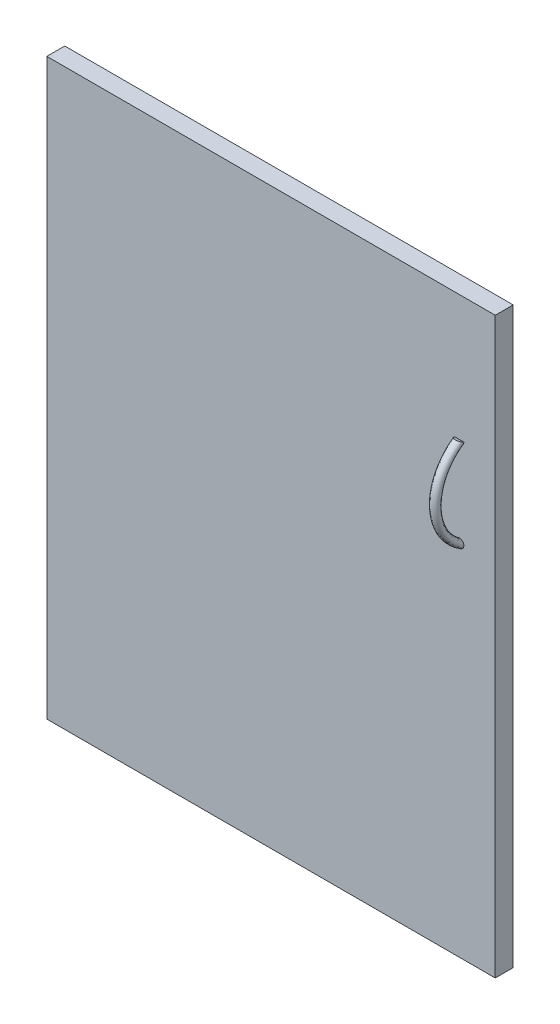
ISO-10303-21;
HEADER;
FILE_DESCRIPTION(('STEP AP214'),'2;1');
FILE_NAME('part.step','',(''),(''),'','','');
FILE_SCHEMA(('AUTOMOTIVE_DESIGN { 1 0 10303 214 1 1 1 1 }'));
ENDSEC;
DATA;
#1=APPLICATION_CONTEXT('core data for automotive mechanical design processes');
#2=APPLICATION_PROTOCOL_DEFINITION('international standard','automotive_design',2000,#1);
#3=PRODUCT_CONTEXT('',#1,'mechanical');
#4=PRODUCT('Part','Part','',(#3));
#5=PRODUCT_RELATED_PRODUCT_CATEGORY('part','',(#4));
#6=PRODUCT_DEFINITION_FORMATION('','',#4);
#7=PRODUCT_DEFINITION_CONTEXT('part definition',#1,'design');
#8=PRODUCT_DEFINITION('design','',#6,#7);
#9=PRODUCT_DEFINITION_SHAPE('','',#8);
#10=(LENGTH_UNIT() NAMED_UNIT(*) SI_UNIT(.MILLI.,.METRE.));
#11=(NAMED_UNIT(*) PLANE_ANGLE_UNIT() SI_UNIT($,.RADIAN.));
#12=(NAMED_UNIT(*) SI_UNIT($,.STERADIAN.) SOLID_ANGLE_UNIT());
#13=UNCERTAINTY_MEASURE_WITH_UNIT(LENGTH_MEASURE(1.E-05),#10,'distance_accuracy_value','');
#14=(GEOMETRIC_REPRESENTATION_CONTEXT(3) GLOBAL_UNCERTAINTY_ASSIGNED_CONTEXT((#13)) GLOBAL_UNIT_ASSIGNED_CONTEXT((#10,
#11,#12)) REPRESENTATION_CONTEXT('',''));
#15=CARTESIAN_POINT('',(0.,0.,0.));
#16=DIRECTION('',(0.,0.,1.));
#17=DIRECTION('',(1.,0.,0.));
#18=AXIS2_PLACEMENT_3D('',#15,#16,#17);
#19=CARTESIAN_POINT('',(12.5,16.,1.));
#20=DIRECTION('',(-1.,0.,0.));
#21=DIRECTION('',(0.,-1.,0.));
#22=AXIS2_PLACEMENT_3D('',#19,#20,#21);
#23=PLANE('',#22);
#24=DIRECTION('',(0.,1.,0.));
#25=VECTOR('',#24,1.);
#26=CARTESIAN_POINT('',(12.5,16.,0.));
#27=LINE('',#26,#25);
#28=CARTESIAN_POINT('',(12.5,-16.,0.));
#29=VERTEX_POINT('',#28);
#30=CARTESIAN_POINT('',(12.5,16.,0.));
#31=VERTEX_POINT('',#30);
#32=EDGE_CURVE('E99',#29,#31,#27,.T.);
#33=ORIENTED_EDGE('',*,*,#32,.T.);
#34=DIRECTION('',(0.,0.,-1.));
#35=VECTOR('',#34,1.);
#36=CARTESIAN_POINT('',(12.5,16.,1.));
#37=LINE('',#36,#35);
#38=CARTESIAN_POINT('',(12.5,16.,1.));
#39=VERTEX_POINT('',#38);
#40=EDGE_CURVE('E96',#39,#31,#37,.T.);
#41=ORIENTED_EDGE('',*,*,#40,.F.);
#42=DIRECTION('',(0.,1.,0.));
#43=VECTOR('',#42,1.);
#44=CARTESIAN_POINT('',(12.5,16.,1.));
#45=LINE('',#44,#43);
#46=CARTESIAN_POINT('',(12.5,-16.,1.));
#47=VERTEX_POINT('',#46);
#48=EDGE_CURVE('E105',#47,#39,#45,.T.);
#49=ORIENTED_EDGE('',*,*,#48,.F.);
#50=DIRECTION('',(0.,0.,-1.));
#51=VECTOR('',#50,1.);
#52=CARTESIAN_POINT('',(12.5,-16.,1.));
#53=LINE('',#52,#51);
#54=EDGE_CURVE('E110',#47,#29,#53,.T.);
#55=ORIENTED_EDGE('',*,*,#54,.T.);
#56=EDGE_LOOP('',(#33,#41,#49,#55));
#57=FACE_BOUND('',#56,.T.);
#58=ADVANCED_FACE('F35',(#57),#23,.F.);
#59=CARTESIAN_POINT('',(-12.5,16.,1.));
#60=DIRECTION('',(0.,-1.,0.));
#61=DIRECTION('',(0.,0.,-1.));
#62=AXIS2_PLACEMENT_3D('',#59,#60,#61);
#63=PLANE('',#62);
#64=DIRECTION('',(-1.,0.,0.));
#65=VECTOR('',#64,1.);
#66=CARTESIAN_POINT('',(-12.5,16.,0.));
#67=LINE('',#66,#65);
#68=CARTESIAN_POINT('',(-12.5,16.,0.));
#69=VERTEX_POINT('',#68);
#70=EDGE_CURVE('E102',#31,#69,#67,.T.);
#71=ORIENTED_EDGE('',*,*,#70,.T.);
#72=DIRECTION('',(0.,0.,-1.));
#73=VECTOR('',#72,1.);
#74=CARTESIAN_POINT('',(-12.5,16.,1.));
#75=LINE('',#74,#73);
#76=CARTESIAN_POINT('',(-12.5,16.,1.));
#77=VERTEX_POINT('',#76);
#78=EDGE_CURVE('E119',#77,#69,#75,.T.);
#79=ORIENTED_EDGE('',*,*,#78,.F.);
#80=DIRECTION('',(-1.,0.,0.));
#81=VECTOR('',#80,1.);
#82=CARTESIAN_POINT('',(-12.5,16.,1.));
#83=LINE('',#82,#81);
#84=EDGE_CURVE('E86',#39,#77,#83,.T.);
#85=ORIENTED_EDGE('',*,*,#84,.F.);
#86=ORIENTED_EDGE('',*,*,#40,.T.);
#87=EDGE_LOOP('',(#71,#79,#85,#86));
#88=FACE_BOUND('',#87,.T.);
#89=ADVANCED_FACE('F147',(#88),#63,.F.);
#90=CARTESIAN_POINT('',(-12.5,16.,1.));
#91=DIRECTION('',(1.,0.,0.));
#92=DIRECTION('',(0.,1.,0.));
#93=AXIS2_PLACEMENT_3D('',#90,#91,#92);
#94=PLANE('',#93);
#95=DIRECTION('',(0.,-1.,0.));
#96=VECTOR('',#95,1.);
#97=CARTESIAN_POINT('',(-12.5,16.,0.));
#98=LINE('',#97,#96);
#99=CARTESIAN_POINT('',(-12.5,-16.,0.));
#100=VERTEX_POINT('',#99);
#101=EDGE_CURVE('E113',#69,#100,#98,.T.);
#102=ORIENTED_EDGE('',*,*,#101,.T.);
#103=DIRECTION('',(0.,0.,-1.));
#104=VECTOR('',#103,1.);
#105=CARTESIAN_POINT('',(-12.5,-16.,1.));
#106=LINE('',#105,#104);
#107=CARTESIAN_POINT('',(-12.5,-16.,1.));
#108=VERTEX_POINT('',#107);
#109=EDGE_CURVE('E117',#108,#100,#106,.T.);
#110=ORIENTED_EDGE('',*,*,#109,.F.);
#111=DIRECTION('',(0.,-1.,0.));
#112=VECTOR('',#111,1.);
#113=CARTESIAN_POINT('',(-12.5,16.,1.));
#114=LINE('',#113,#112);
#115=EDGE_CURVE('E108',#77,#108,#114,.T.);
#116=ORIENTED_EDGE('',*,*,#115,.F.);
#117=ORIENTED_EDGE('',*,*,#78,.T.);
#118=EDGE_LOOP('',(#102,#110,#116,#117));
#119=FACE_BOUND('',#118,.T.);
#120=ADVANCED_FACE('F152',(#119),#94,.F.);
#121=CARTESIAN_POINT('',(-12.5,-16.,1.));
#122=DIRECTION('',(0.,1.,0.));
#123=DIRECTION('',(0.,0.,1.));
#124=AXIS2_PLACEMENT_3D('',#121,#122,#123);
#125=PLANE('',#124);
#126=DIRECTION('',(1.,0.,0.));
#127=VECTOR('',#126,1.);
#128=CARTESIAN_POINT('',(-12.5,-16.,0.));
#129=LINE('',#128,#127);
#130=EDGE_CURVE('E78',#100,#29,#129,.T.);
#131=ORIENTED_EDGE('',*,*,#130,.T.);
#132=ORIENTED_EDGE('',*,*,#54,.F.);
#133=DIRECTION('',(1.,0.,0.));
#134=VECTOR('',#133,1.);
#135=CARTESIAN_POINT('',(-12.5,-16.,1.));
#136=LINE('',#135,#134);
#137=EDGE_CURVE('E57',#108,#47,#136,.T.);
#138=ORIENTED_EDGE('',*,*,#137,.F.);
#139=ORIENTED_EDGE('',*,*,#109,.T.);
#140=EDGE_LOOP('',(#131,#132,#138,#139));
#141=FACE_BOUND('',#140,.T.);
#142=ADVANCED_FACE('F161',(#141),#125,.F.);
#143=CARTESIAN_POINT('',(0.,0.,1.));
#144=DIRECTION('',(0.,0.,1.));
#145=DIRECTION('',(1.,0.,0.));
#146=AXIS2_PLACEMENT_3D('',#143,#144,#145);
#147=PLANE('',#146);
#148=CARTESIAN_POINT('',(10.5,4.,1.));
#149=DIRECTION('',(0.,0.,1.));
#150=DIRECTION('',(1.,0.,0.));
#151=AXIS2_PLACEMENT_3D('',#148,#149,#150);
#152=CIRCLE('',#151,0.25);
#153=CARTESIAN_POINT('',(10.75,4.,1.));
#154=VERTEX_POINT('',#153);
#155=EDGE_CURVE('E11',#154,#154,#152,.T.);
#156=ORIENTED_EDGE('',*,*,#155,.F.);
#157=EDGE_LOOP('',(#156));
#158=FACE_BOUND('',#157,.T.);
#159=DIRECTION('',(-1.,0.,0.));
#160=VECTOR('',#159,1.);
#161=CARTESIAN_POINT('',(0.,9.,1.));
#162=LINE('',#161,#160);
#163=CARTESIAN_POINT('',(10.75,9.,1.));
#164=VERTEX_POINT('',#163);
#165=CARTESIAN_POINT('',(10.25,8.99999999999961,1.));
#166=VERTEX_POINT('',#165);
#167=EDGE_CURVE('E42',#164,#166,#162,.T.);
#168=ORIENTED_EDGE('',*,*,#167,.F.);
#169=CARTESIAN_POINT('',(10.25,8.99999999999961,1.));
#170=CARTESIAN_POINT('',(10.2499849383462,8.98521380831302,1.));
#171=CARTESIAN_POINT('',(10.2513107879814,8.97043090602274,1.));
#172=CARTESIAN_POINT('',(10.2565342684534,8.94134485033556,1.));
#173=CARTESIAN_POINT('',(10.2604287156994,8.92704112606339,1.));
#174=CARTESIAN_POINT('',(10.2704349955121,8.90000922152134,1.));
#175=CARTESIAN_POINT('',(10.2764320160511,8.88723841818464,1.));
#176=CARTESIAN_POINT('',(10.2904825810203,8.86288754550716,1.));
#177=CARTESIAN_POINT('',(10.2985355428519,8.85130714014125,1.));
#178=CARTESIAN_POINT('',(10.3164662379724,8.82966876791737,1.));
#179=CARTESIAN_POINT('',(10.3263429504422,8.81960995507085,1.));
#180=CARTESIAN_POINT('',(10.3476589094819,8.80127896220533,1.));
#181=CARTESIAN_POINT('',(10.3591003242637,8.79300930321421,1.));
#182=CARTESIAN_POINT('',(10.3831932114465,8.77851971922293,1.));
#183=CARTESIAN_POINT('',(10.3958430021192,8.7722969975675,1.));
#184=CARTESIAN_POINT('',(10.4220250251267,8.7620551260108,1.));
#185=CARTESIAN_POINT('',(10.4355584238193,8.75803895734081,1.));
#186=CARTESIAN_POINT('',(10.4630982543969,8.75233921796589,1.));
#187=CARTESIAN_POINT('',(10.4771043618048,8.75065407926,1.));
#188=CARTESIAN_POINT('',(10.5052006918618,8.74965913010081,1.));
#189=CARTESIAN_POINT('',(10.5192909145128,8.7503493197005,1.));
#190=CARTESIAN_POINT('',(10.5471649338561,8.75408673860879,1.));
#191=CARTESIAN_POINT('',(10.5609485178429,8.75713555460837,1.));
#192=CARTESIAN_POINT('',(10.5877894183578,8.76549977698985,1.));
#193=CARTESIAN_POINT('',(10.6008476872816,8.77081212763868,1.));
#194=CARTESIAN_POINT('',(10.6259051598728,8.78356118255448,1.));
#195=CARTESIAN_POINT('',(10.6379028843724,8.79100079442047,1.));
#196=CARTESIAN_POINT('',(10.6604620598936,8.80777811884476,1.));
#197=CARTESIAN_POINT('',(10.6710254944948,8.81711316452532,1.));
#198=CARTESIAN_POINT('',(10.6904502594716,8.8374374474221,0.999999999999999));
#199=CARTESIAN_POINT('',(10.6993091763776,8.84842899144101,0.999999999999997));
#200=CARTESIAN_POINT('',(10.7150431990228,8.87172799978713,1.));
#201=CARTESIAN_POINT('',(10.7219210843864,8.8840335867711,1.00000000000001));
#202=CARTESIAN_POINT('',(10.7335244640276,8.90964299397018,0.999999999999988));
#203=CARTESIAN_POINT('',(10.7382465667954,8.92294834900592,0.999999999999958));
#204=CARTESIAN_POINT('',(10.7453800964998,8.95014517930888,1.00000000000004));
#205=CARTESIAN_POINT('',(10.7477954860292,8.96403560648079,1.00000000000016));
#206=CARTESIAN_POINT('',(10.7496782736988,8.98533103875346,0.999999999999827));
#207=CARTESIAN_POINT('',(10.7500024341253,8.99266762535788,0.999999999999624));
#208=CARTESIAN_POINT('',(10.75,8.99999999999985,0.999999999999273));
#209=B_SPLINE_CURVE_WITH_KNOTS('',3,(#169,#170,#171,#172,#173,#174,#175,#176,#177,#178,#179,
#180,#181,#182,#183,#184,#185,#186,#187,#188,#189,#190,#191,#192,#193,#194,#195,#196,#197,#198,
#199,#200,#201,#202,#203,#204,#205,#206,#207,#208),.UNSPECIFIED.,.F.,.F.,(4,2,2,2,2,2,2,2,2,2,2,
2,2,2,2,2,2,2,2,4),(0.,0.0442952865142476,0.0885357751367148,0.130662886941268,
0.172778074274131,0.214869759279339,0.257020373261495,0.299113156873605,0.341262672254039,
0.38338382134441,0.425504971374234,0.467654481735632,0.509747270365631,0.551897869871189,
0.593989569352206,0.636140435884225,0.678231868338639,0.720389293392306,0.762474167249236,
0.784475293763798),.UNSPECIFIED.);
#210=EDGE_CURVE('E48',#166,#164,#209,.T.);
#211=ORIENTED_EDGE('',*,*,#210,.F.);
#212=EDGE_LOOP('',(#168,#211));
#213=FACE_BOUND('',#212,.T.);
#214=ORIENTED_EDGE('',*,*,#48,.T.);
#215=ORIENTED_EDGE('',*,*,#84,.T.);
#216=ORIENTED_EDGE('',*,*,#115,.T.);
#217=ORIENTED_EDGE('',*,*,#137,.T.);
#218=EDGE_LOOP('',(#214,#215,#216,#217));
#219=FACE_BOUND('',#218,.T.);
#220=ADVANCED_FACE('F88',(#158,#213,#219),#147,.T.);
#221=CARTESIAN_POINT('',(0.,0.,0.));
#222=DIRECTION('',(0.,0.,1.));
#223=DIRECTION('',(1.,0.,0.));
#224=AXIS2_PLACEMENT_3D('',#221,#222,#223);
#225=PLANE('',#224);
#226=ORIENTED_EDGE('',*,*,#32,.F.);
#227=ORIENTED_EDGE('',*,*,#130,.F.);
#228=ORIENTED_EDGE('',*,*,#101,.F.);
#229=ORIENTED_EDGE('',*,*,#70,.F.);
#230=EDGE_LOOP('',(#226,#227,#228,#229));
#231=FACE_BOUND('',#230,.T.);
#232=ADVANCED_FACE('F135',(#231),#225,.F.);
#233=CARTESIAN_POINT('',(10.5,9.,1.));
#234=DIRECTION('',(0.,0.921284663987611,-0.388888888888889));
#235=DIRECTION('',(1.,0.,0.));
#236=AXIS2_PLACEMENT_3D('',#233,#234,#235);
#237=PLANE('',#236);
#238=CARTESIAN_POINT('',(10.5,9.,1.));
#239=DIRECTION('',(0.,0.921284663987611,-0.388888888888889));
#240=DIRECTION('',(1.,0.,0.));
#241=AXIS2_PLACEMENT_3D('',#238,#239,#240);
#242=CIRCLE('',#241,0.25);
#243=EDGE_CURVE('E95',#166,#164,#242,.T.);
#244=ORIENTED_EDGE('',*,*,#243,.T.);
#245=ORIENTED_EDGE('',*,*,#167,.T.);
#246=EDGE_LOOP('',(#244,#245));
#247=FACE_BOUND('',#246,.T.);
#248=ADVANCED_FACE('F98',(#247),#237,.T.);
#249=CARTESIAN_POINT('',(10.75,4.,1.));
#250=CARTESIAN_POINT('',(10.75,5.31265703616725,2.97890493972125));
#251=CARTESIAN_POINT('',(10.75,7.68734296383275,2.97890493972125));
#252=CARTESIAN_POINT('',(10.75,9.,1.));
#253=CARTESIAN_POINT('',(10.75,4.5,1.));
#254=CARTESIAN_POINT('',(10.75,5.81265703616725,2.583123951777));
#255=CARTESIAN_POINT('',(10.75,7.85752547387921,2.36434777908246));
#256=CARTESIAN_POINT('',(10.75,8.80555555555556,0.539357668006197));
#257=CARTESIAN_POINT('',(10.25,4.5,1.));
#258=CARTESIAN_POINT('',(10.25,5.81265703616725,2.583123951777));
#259=CARTESIAN_POINT('',(10.25,7.85752547387921,2.36434777908246));
#260=CARTESIAN_POINT('',(10.25,8.80555555555556,0.539357668006197));
#261=CARTESIAN_POINT('',(10.25,4.,1.));
#262=CARTESIAN_POINT('',(10.25,5.31265703616725,2.97890493972125));
#263=CARTESIAN_POINT('',(10.25,7.68734296383275,2.97890493972125));
#264=CARTESIAN_POINT('',(10.25,9.,1.));
#265=CARTESIAN_POINT('',(10.25,3.5,1.));
#266=CARTESIAN_POINT('',(10.25,4.81265703616725,3.3746859276655));
#267=CARTESIAN_POINT('',(10.25,7.51716045378629,3.59346210036004));
#268=CARTESIAN_POINT('',(10.25,9.19444444444445,1.46064233199381));
#269=CARTESIAN_POINT('',(10.75,3.5,1.));
#270=CARTESIAN_POINT('',(10.75,4.81265703616725,3.3746859276655));
#271=CARTESIAN_POINT('',(10.75,7.51716045378629,3.59346210036004));
#272=CARTESIAN_POINT('',(10.75,9.19444444444445,1.46064233199381));
#273=CARTESIAN_POINT('',(10.75,4.,1.));
#274=CARTESIAN_POINT('',(10.75,5.31265703616725,2.97890493972125));
#275=CARTESIAN_POINT('',(10.75,7.68734296383275,2.97890493972125));
#276=CARTESIAN_POINT('',(10.75,9.,1.));
#277=(BOUNDED_SURFACE() B_SPLINE_SURFACE(3,3,((#249,#250,#251,#252),(#253,#254,#255,#256),(#257,
#258,#259,#260),(#261,#262,#263,#264),(#265,#266,#267,#268),(#269,#270,#271,#272),(#273,#274,
#275,#276)),.UNSPECIFIED.,.T.,.F.,.F.) B_SPLINE_SURFACE_WITH_KNOTS((4,3,4),(4,4),(0.,0.5,1.),
(0.,1.),.UNSPECIFIED.) GEOMETRIC_REPRESENTATION_ITEM() RATIONAL_B_SPLINE_SURFACE(((1.,
0.701847198928378,0.701847198928378,1.),(0.333333333333333,0.233949066309459,0.233949066309459,
0.333333333333333),(0.333333333333333,0.233949066309459,0.233949066309459,0.333333333333333),
(1.,0.701847198928378,0.701847198928378,1.),(0.333333333333333,0.233949066309459,
0.233949066309459,0.333333333333333),(0.333333333333333,0.233949066309459,0.233949066309459,
0.333333333333333),(1.,0.701847198928378,0.701847198928378,1.))) REPRESENTATION_ITEM('') SURFACE());
#278=ORIENTED_EDGE('',*,*,#243,.F.);
#279=ORIENTED_EDGE('',*,*,#210,.T.);
#280=EDGE_LOOP('',(#278,#279));
#281=FACE_BOUND('',#280,.T.);
#282=ORIENTED_EDGE('',*,*,#155,.T.);
#283=EDGE_LOOP('',(#282));
#284=FACE_BOUND('',#283,.T.);
#285=ADVANCED_FACE('F93',(#281,#284),#277,.T.);
#286=CLOSED_SHELL('',(#58,#89,#120,#142,#220,#232,#248,#285));
#287=MANIFOLD_SOLID_BREP('B2',#286);
#288=ADVANCED_BREP_SHAPE_REPRESENTATION('',(#18,#287),#14);
#289=SHAPE_DEFINITION_REPRESENTATION(#9,#288);
ENDSEC;
END-ISO-10303-21;
